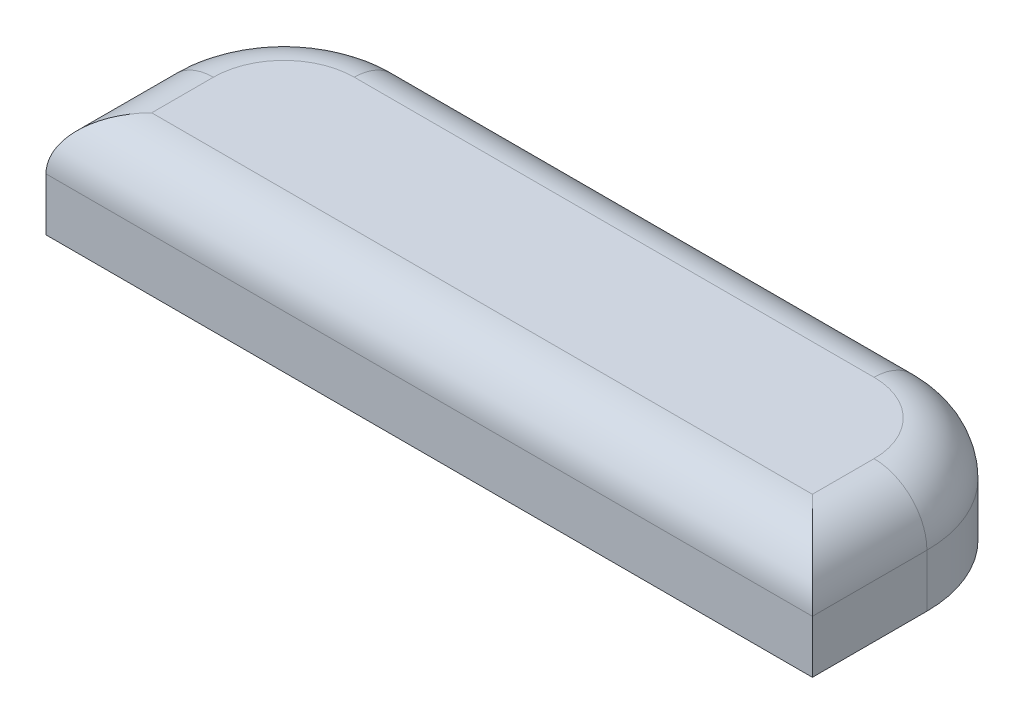
ISO-10303-21;
HEADER;
FILE_DESCRIPTION(('STEP AP214'),'2;1');
FILE_NAME('part.step','',(''),(''),'','','');
FILE_SCHEMA(('AUTOMOTIVE_DESIGN { 1 0 10303 214 1 1 1 1 }'));
ENDSEC;
DATA;
#1=APPLICATION_CONTEXT('core data for automotive mechanical design processes');
#2=APPLICATION_PROTOCOL_DEFINITION('international standard','automotive_design',2000,#1);
#3=PRODUCT_CONTEXT('',#1,'mechanical');
#4=PRODUCT('Part','Part','',(#3));
#5=PRODUCT_RELATED_PRODUCT_CATEGORY('part','',(#4));
#6=PRODUCT_DEFINITION_FORMATION('','',#4);
#7=PRODUCT_DEFINITION_CONTEXT('part definition',#1,'design');
#8=PRODUCT_DEFINITION('design','',#6,#7);
#9=PRODUCT_DEFINITION_SHAPE('','',#8);
#10=(LENGTH_UNIT() NAMED_UNIT(*) SI_UNIT(.MILLI.,.METRE.));
#11=(NAMED_UNIT(*) PLANE_ANGLE_UNIT() SI_UNIT($,.RADIAN.));
#12=(NAMED_UNIT(*) SI_UNIT($,.STERADIAN.) SOLID_ANGLE_UNIT());
#13=UNCERTAINTY_MEASURE_WITH_UNIT(LENGTH_MEASURE(1.E-05),#10,'distance_accuracy_value','');
#14=(GEOMETRIC_REPRESENTATION_CONTEXT(3) GLOBAL_UNCERTAINTY_ASSIGNED_CONTEXT((#13)) GLOBAL_UNIT_ASSIGNED_CONTEXT((#10,
#11,#12)) REPRESENTATION_CONTEXT('',''));
#15=CARTESIAN_POINT('',(0.,0.,0.));
#16=DIRECTION('',(0.,0.,1.));
#17=DIRECTION('',(1.,0.,0.));
#18=AXIS2_PLACEMENT_3D('',#15,#16,#17);
#19=CARTESIAN_POINT('',(382.577970856823,-283.78151591528,27.));
#20=DIRECTION('',(0.,0.,-1.));
#21=DIRECTION('',(-1.,0.,0.));
#22=AXIS2_PLACEMENT_3D('',#19,#20,#21);
#23=PLANE('',#22);
#24=DIRECTION('',(0.,-1.,0.));
#25=VECTOR('',#24,1.);
#26=CARTESIAN_POINT('',(469.577970856823,-283.78151591528,27.));
#27=LINE('',#26,#25);
#28=CARTESIAN_POINT('',(469.577970856823,-289.78151591528,27.));
#29=VERTEX_POINT('',#28);
#30=CARTESIAN_POINT('',(469.577970856823,-295.78151591528,27.));
#31=VERTEX_POINT('',#30);
#32=EDGE_CURVE('E107',#29,#31,#27,.T.);
#33=ORIENTED_EDGE('',*,*,#32,.F.);
#34=DIRECTION('',(1.,0.,0.));
#35=VECTOR('',#34,1.);
#36=CARTESIAN_POINT('',(382.577970856823,-289.78151591528,27.));
#37=LINE('',#36,#35);
#38=CARTESIAN_POINT('',(382.577970856823,-289.78151591528,27.));
#39=VERTEX_POINT('',#38);
#40=EDGE_CURVE('E11',#29,#39,#37,.F.);
#41=ORIENTED_EDGE('',*,*,#40,.T.);
#42=DIRECTION('',(0.,-1.,0.));
#43=VECTOR('',#42,1.);
#44=CARTESIAN_POINT('',(382.577970856823,-283.78151591528,27.));
#45=LINE('',#44,#43);
#46=CARTESIAN_POINT('',(382.577970856823,-295.78151591528,27.));
#47=VERTEX_POINT('',#46);
#48=EDGE_CURVE('E128',#39,#47,#45,.T.);
#49=ORIENTED_EDGE('',*,*,#48,.T.);
#50=DIRECTION('',(1.,0.,0.));
#51=VECTOR('',#50,1.);
#52=CARTESIAN_POINT('',(382.577970856823,-295.78151591528,27.));
#53=LINE('',#52,#51);
#54=EDGE_CURVE('E122',#47,#31,#53,.T.);
#55=ORIENTED_EDGE('',*,*,#54,.T.);
#56=EDGE_LOOP('',(#33,#41,#49,#55));
#57=FACE_BOUND('',#56,.T.);
#58=ADVANCED_FACE('F37',(#57),#23,.F.);
#59=CARTESIAN_POINT('',(469.577970856823,-283.78151591528,27.));
#60=DIRECTION('',(-1.,0.,0.));
#61=DIRECTION('',(0.,0.,1.));
#62=AXIS2_PLACEMENT_3D('',#59,#60,#61);
#63=PLANE('',#62);
#64=DIRECTION('',(0.,-1.,0.));
#65=VECTOR('',#64,1.);
#66=CARTESIAN_POINT('',(469.577970856823,-283.78151591528,14.));
#67=LINE('',#66,#65);
#68=CARTESIAN_POINT('',(469.577970856823,-289.78151591528,14.));
#69=VERTEX_POINT('',#68);
#70=CARTESIAN_POINT('',(469.577970856823,-295.78151591528,14.));
#71=VERTEX_POINT('',#70);
#72=EDGE_CURVE('E116',#69,#71,#67,.T.);
#73=ORIENTED_EDGE('',*,*,#72,.F.);
#74=DIRECTION('',(0.,0.,-1.));
#75=VECTOR('',#74,1.);
#76=CARTESIAN_POINT('',(469.577970856823,-289.78151591528,27.));
#77=LINE('',#76,#75);
#78=EDGE_CURVE('E46',#69,#29,#77,.F.);
#79=ORIENTED_EDGE('',*,*,#78,.T.);
#80=ORIENTED_EDGE('',*,*,#32,.T.);
#81=DIRECTION('',(0.,0.,-1.));
#82=VECTOR('',#81,1.);
#83=CARTESIAN_POINT('',(469.577970856823,-295.78151591528,27.));
#84=LINE('',#83,#82);
#85=EDGE_CURVE('E110',#31,#71,#84,.T.);
#86=ORIENTED_EDGE('',*,*,#85,.T.);
#87=EDGE_LOOP('',(#73,#79,#80,#86));
#88=FACE_BOUND('',#87,.T.);
#89=ADVANCED_FACE('F109',(#88),#63,.F.);
#90=CARTESIAN_POINT('',(455.577970856823,-283.78151591528,14.));
#91=DIRECTION('',(0.,-1.,0.));
#92=DIRECTION('',(0.,0.,-1.));
#93=AXIS2_PLACEMENT_3D('',#90,#91,#92);
#94=CYLINDRICAL_SURFACE('',#93,14.);
#95=DIRECTION('',(0.,-1.,0.));
#96=VECTOR('',#95,1.);
#97=CARTESIAN_POINT('',(455.577970856823,-283.78151591528,0.));
#98=LINE('',#97,#96);
#99=CARTESIAN_POINT('',(455.577970856823,-289.78151591528,0.));
#100=VERTEX_POINT('',#99);
#101=CARTESIAN_POINT('',(455.577970856823,-295.78151591528,0.));
#102=VERTEX_POINT('',#101);
#103=EDGE_CURVE('E148',#100,#102,#98,.T.);
#104=ORIENTED_EDGE('',*,*,#103,.F.);
#105=CARTESIAN_POINT('',(455.577970856823,-289.78151591528,14.));
#106=DIRECTION('',(0.,1.,0.));
#107=DIRECTION('',(0.,0.,1.));
#108=AXIS2_PLACEMENT_3D('',#105,#106,#107);
#109=CIRCLE('',#108,14.);
#110=EDGE_CURVE('E61',#100,#69,#109,.F.);
#111=ORIENTED_EDGE('',*,*,#110,.T.);
#112=ORIENTED_EDGE('',*,*,#72,.T.);
#113=CARTESIAN_POINT('',(455.577970856823,-295.78151591528,14.));
#114=DIRECTION('',(0.,1.,0.));
#115=DIRECTION('',(0.,0.,1.));
#116=AXIS2_PLACEMENT_3D('',#113,#114,#115);
#117=CIRCLE('',#116,14.);
#118=EDGE_CURVE('E125',#71,#102,#117,.T.);
#119=ORIENTED_EDGE('',*,*,#118,.T.);
#120=EDGE_LOOP('',(#104,#111,#112,#119));
#121=FACE_BOUND('',#120,.T.);
#122=ADVANCED_FACE('F230',(#121),#94,.T.);
#123=CARTESIAN_POINT('',(455.577970856823,-283.78151591528,0.));
#124=DIRECTION('',(0.,0.,1.));
#125=DIRECTION('',(1.,0.,0.));
#126=AXIS2_PLACEMENT_3D('',#123,#124,#125);
#127=PLANE('',#126);
#128=DIRECTION('',(0.,-1.,0.));
#129=VECTOR('',#128,1.);
#130=CARTESIAN_POINT('',(396.577970856823,-283.78151591528,0.));
#131=LINE('',#130,#129);
#132=CARTESIAN_POINT('',(396.577970856823,-289.78151591528,0.));
#133=VERTEX_POINT('',#132);
#134=CARTESIAN_POINT('',(396.577970856823,-295.78151591528,0.));
#135=VERTEX_POINT('',#134);
#136=EDGE_CURVE('E146',#133,#135,#131,.T.);
#137=ORIENTED_EDGE('',*,*,#136,.F.);
#138=DIRECTION('',(-1.,0.,0.));
#139=VECTOR('',#138,1.);
#140=CARTESIAN_POINT('',(455.577970856823,-289.78151591528,0.));
#141=LINE('',#140,#139);
#142=EDGE_CURVE('E168',#133,#100,#141,.F.);
#143=ORIENTED_EDGE('',*,*,#142,.T.);
#144=ORIENTED_EDGE('',*,*,#103,.T.);
#145=DIRECTION('',(-1.,0.,0.));
#146=VECTOR('',#145,1.);
#147=CARTESIAN_POINT('',(455.577970856823,-295.78151591528,0.));
#148=LINE('',#147,#146);
#149=EDGE_CURVE('E135',#102,#135,#148,.T.);
#150=ORIENTED_EDGE('',*,*,#149,.T.);
#151=EDGE_LOOP('',(#137,#143,#144,#150));
#152=FACE_BOUND('',#151,.T.);
#153=ADVANCED_FACE('F215',(#152),#127,.F.);
#154=CARTESIAN_POINT('',(396.577970856823,-283.78151591528,14.));
#155=DIRECTION('',(0.,-1.,0.));
#156=DIRECTION('',(0.,0.,-1.));
#157=AXIS2_PLACEMENT_3D('',#154,#155,#156);
#158=CYLINDRICAL_SURFACE('',#157,14.);
#159=DIRECTION('',(0.,-1.,0.));
#160=VECTOR('',#159,1.);
#161=CARTESIAN_POINT('',(382.577970856823,-283.78151591528,14.));
#162=LINE('',#161,#160);
#163=CARTESIAN_POINT('',(382.577970856823,-289.78151591528,14.));
#164=VERTEX_POINT('',#163);
#165=CARTESIAN_POINT('',(382.577970856823,-295.78151591528,14.));
#166=VERTEX_POINT('',#165);
#167=EDGE_CURVE('E144',#164,#166,#162,.T.);
#168=ORIENTED_EDGE('',*,*,#167,.F.);
#169=CARTESIAN_POINT('',(396.577970856823,-289.78151591528,14.));
#170=DIRECTION('',(0.,1.,0.));
#171=DIRECTION('',(0.,0.,1.));
#172=AXIS2_PLACEMENT_3D('',#169,#170,#171);
#173=CIRCLE('',#172,14.);
#174=EDGE_CURVE('E166',#164,#133,#173,.F.);
#175=ORIENTED_EDGE('',*,*,#174,.T.);
#176=ORIENTED_EDGE('',*,*,#136,.T.);
#177=CARTESIAN_POINT('',(396.577970856823,-295.78151591528,14.));
#178=DIRECTION('',(0.,1.,0.));
#179=DIRECTION('',(0.,0.,1.));
#180=AXIS2_PLACEMENT_3D('',#177,#178,#179);
#181=CIRCLE('',#180,14.);
#182=EDGE_CURVE('E138',#135,#166,#181,.T.);
#183=ORIENTED_EDGE('',*,*,#182,.T.);
#184=EDGE_LOOP('',(#168,#175,#176,#183));
#185=FACE_BOUND('',#184,.T.);
#186=ADVANCED_FACE('F212',(#185),#158,.T.);
#187=CARTESIAN_POINT('',(382.577970856823,-283.78151591528,14.));
#188=DIRECTION('',(1.,0.,0.));
#189=DIRECTION('',(0.,0.,-1.));
#190=AXIS2_PLACEMENT_3D('',#187,#188,#189);
#191=PLANE('',#190);
#192=ORIENTED_EDGE('',*,*,#48,.F.);
#193=DIRECTION('',(0.,0.,1.));
#194=VECTOR('',#193,1.);
#195=CARTESIAN_POINT('',(382.577970856823,-289.78151591528,14.));
#196=LINE('',#195,#194);
#197=EDGE_CURVE('E163',#39,#164,#196,.F.);
#198=ORIENTED_EDGE('',*,*,#197,.T.);
#199=ORIENTED_EDGE('',*,*,#167,.T.);
#200=DIRECTION('',(0.,0.,1.));
#201=VECTOR('',#200,1.);
#202=CARTESIAN_POINT('',(382.577970856823,-295.78151591528,14.));
#203=LINE('',#202,#201);
#204=EDGE_CURVE('E141',#166,#47,#203,.T.);
#205=ORIENTED_EDGE('',*,*,#204,.T.);
#206=EDGE_LOOP('',(#192,#198,#199,#205));
#207=FACE_BOUND('',#206,.T.);
#208=ADVANCED_FACE('F201',(#207),#191,.F.);
#209=CARTESIAN_POINT('',(455.577970856823,-283.78151591528,14.));
#210=DIRECTION('',(0.,1.,0.));
#211=DIRECTION('',(0.,0.,1.));
#212=AXIS2_PLACEMENT_3D('',#209,#210,#211);
#213=PLANE('',#212);
#214=CARTESIAN_POINT('',(396.577970856823,-283.78151591528,14.));
#215=DIRECTION('',(0.,1.,0.));
#216=DIRECTION('',(0.,0.,1.));
#217=AXIS2_PLACEMENT_3D('',#214,#215,#216);
#218=CIRCLE('',#217,8.00000000000001);
#219=CARTESIAN_POINT('',(396.577970856823,-283.78151591528,6.));
#220=VERTEX_POINT('',#219);
#221=CARTESIAN_POINT('',(388.577970856823,-283.78151591528,14.));
#222=VERTEX_POINT('',#221);
#223=EDGE_CURVE('E158',#220,#222,#218,.T.);
#224=ORIENTED_EDGE('',*,*,#223,.T.);
#225=DIRECTION('',(0.,0.,1.));
#226=VECTOR('',#225,1.);
#227=CARTESIAN_POINT('',(388.577970856823,-283.78151591528,27.));
#228=LINE('',#227,#226);
#229=CARTESIAN_POINT('',(388.577970856823,-283.78151591528,21.));
#230=VERTEX_POINT('',#229);
#231=EDGE_CURVE('E160',#222,#230,#228,.T.);
#232=ORIENTED_EDGE('',*,*,#231,.T.);
#233=DIRECTION('',(1.,0.,0.));
#234=VECTOR('',#233,1.);
#235=CARTESIAN_POINT('',(469.577970856823,-283.78151591528,21.));
#236=LINE('',#235,#234);
#237=CARTESIAN_POINT('',(463.577970856823,-283.78151591528,21.));
#238=VERTEX_POINT('',#237);
#239=EDGE_CURVE('E115',#230,#238,#236,.T.);
#240=ORIENTED_EDGE('',*,*,#239,.T.);
#241=DIRECTION('',(0.,0.,-1.));
#242=VECTOR('',#241,1.);
#243=CARTESIAN_POINT('',(463.577970856823,-283.78151591528,14.));
#244=LINE('',#243,#242);
#245=CARTESIAN_POINT('',(463.577970856823,-283.78151591528,14.));
#246=VERTEX_POINT('',#245);
#247=EDGE_CURVE('E152',#238,#246,#244,.T.);
#248=ORIENTED_EDGE('',*,*,#247,.T.);
#249=CARTESIAN_POINT('',(455.577970856823,-283.78151591528,14.));
#250=DIRECTION('',(0.,1.,0.));
#251=DIRECTION('',(0.,0.,1.));
#252=AXIS2_PLACEMENT_3D('',#249,#250,#251);
#253=CIRCLE('',#252,8.00000000000001);
#254=CARTESIAN_POINT('',(455.577970856823,-283.78151591528,5.99999999999999));
#255=VERTEX_POINT('',#254);
#256=EDGE_CURVE('E154',#246,#255,#253,.T.);
#257=ORIENTED_EDGE('',*,*,#256,.T.);
#258=DIRECTION('',(-1.,0.,0.));
#259=VECTOR('',#258,1.);
#260=CARTESIAN_POINT('',(396.577970856823,-283.78151591528,6.));
#261=LINE('',#260,#259);
#262=EDGE_CURVE('E156',#255,#220,#261,.T.);
#263=ORIENTED_EDGE('',*,*,#262,.T.);
#264=EDGE_LOOP('',(#224,#232,#240,#248,#257,#263));
#265=FACE_BOUND('',#264,.T.);
#266=ADVANCED_FACE('F191',(#265),#213,.T.);
#267=CARTESIAN_POINT('',(455.577970856823,-295.78151591528,14.));
#268=DIRECTION('',(0.,1.,0.));
#269=DIRECTION('',(0.,0.,1.));
#270=AXIS2_PLACEMENT_3D('',#267,#268,#269);
#271=PLANE('',#270);
#272=ORIENTED_EDGE('',*,*,#54,.F.);
#273=ORIENTED_EDGE('',*,*,#204,.F.);
#274=ORIENTED_EDGE('',*,*,#182,.F.);
#275=ORIENTED_EDGE('',*,*,#149,.F.);
#276=ORIENTED_EDGE('',*,*,#118,.F.);
#277=ORIENTED_EDGE('',*,*,#85,.F.);
#278=EDGE_LOOP('',(#272,#273,#274,#275,#276,#277));
#279=FACE_BOUND('',#278,.T.);
#280=ADVANCED_FACE('F120',(#279),#271,.F.);
#281=CARTESIAN_POINT('',(455.577970856823,-289.78151591528,14.));
#282=DIRECTION('',(0.,1.,0.));
#283=DIRECTION('',(0.,0.,1.));
#284=AXIS2_PLACEMENT_3D('',#281,#282,#283);
#285=TOROIDAL_SURFACE('',#284,8.00000000000001,6.);
#286=CARTESIAN_POINT('',(463.577970856823,-289.78151591528,14.));
#287=DIRECTION('',(0.,0.,1.));
#288=DIRECTION('',(1.,0.,0.));
#289=AXIS2_PLACEMENT_3D('',#286,#287,#288);
#290=CIRCLE('',#289,6.);
#291=EDGE_CURVE('E132',#69,#246,#290,.T.);
#292=ORIENTED_EDGE('',*,*,#291,.F.);
#293=ORIENTED_EDGE('',*,*,#110,.F.);
#294=CARTESIAN_POINT('',(455.577970856823,-289.78151591528,5.99999999999999));
#295=DIRECTION('',(-1.,0.,0.));
#296=DIRECTION('',(0.,0.,1.));
#297=AXIS2_PLACEMENT_3D('',#294,#295,#296);
#298=CIRCLE('',#297,6.);
#299=EDGE_CURVE('E41',#255,#100,#298,.T.);
#300=ORIENTED_EDGE('',*,*,#299,.F.);
#301=ORIENTED_EDGE('',*,*,#256,.F.);
#302=EDGE_LOOP('',(#292,#293,#300,#301));
#303=FACE_BOUND('',#302,.T.);
#304=ADVANCED_FACE('F39',(#303),#285,.T.);
#305=CARTESIAN_POINT('',(455.577970856823,-289.78151591528,5.99999999999999));
#306=DIRECTION('',(1.,0.,0.));
#307=DIRECTION('',(0.,0.,-1.));
#308=AXIS2_PLACEMENT_3D('',#305,#306,#307);
#309=CYLINDRICAL_SURFACE('',#308,6.);
#310=ORIENTED_EDGE('',*,*,#299,.T.);
#311=ORIENTED_EDGE('',*,*,#142,.F.);
#312=CARTESIAN_POINT('',(396.577970856823,-289.78151591528,6.));
#313=DIRECTION('',(-1.,0.,0.));
#314=DIRECTION('',(0.,0.,1.));
#315=AXIS2_PLACEMENT_3D('',#312,#313,#314);
#316=CIRCLE('',#315,6.);
#317=EDGE_CURVE('E179',#220,#133,#316,.T.);
#318=ORIENTED_EDGE('',*,*,#317,.F.);
#319=ORIENTED_EDGE('',*,*,#262,.F.);
#320=EDGE_LOOP('',(#310,#311,#318,#319));
#321=FACE_BOUND('',#320,.T.);
#322=ADVANCED_FACE('F218',(#321),#309,.T.);
#323=CARTESIAN_POINT('',(463.577970856823,-289.78151591528,14.));
#324=DIRECTION('',(0.,0.,1.));
#325=DIRECTION('',(1.,0.,0.));
#326=AXIS2_PLACEMENT_3D('',#323,#324,#325);
#327=CYLINDRICAL_SURFACE('',#326,6.);
#328=ORIENTED_EDGE('',*,*,#291,.T.);
#329=ORIENTED_EDGE('',*,*,#247,.F.);
#330=CARTESIAN_POINT('',(463.577970856823,-289.78151591528,21.));
#331=DIRECTION('',(-0.707106781186547,0.,0.707106781186547));
#332=DIRECTION('',(-0.707106781186547,0.,-0.707106781186547));
#333=AXIS2_PLACEMENT_3D('',#330,#331,#332);
#334=ELLIPSE('',#333,8.48528137423857,6.);
#335=EDGE_CURVE('E176',#29,#238,#334,.T.);
#336=ORIENTED_EDGE('',*,*,#335,.F.);
#337=ORIENTED_EDGE('',*,*,#78,.F.);
#338=EDGE_LOOP('',(#328,#329,#336,#337));
#339=FACE_BOUND('',#338,.T.);
#340=ADVANCED_FACE('F185',(#339),#327,.T.);
#341=CARTESIAN_POINT('',(396.577970856823,-289.78151591528,14.));
#342=DIRECTION('',(0.,1.,0.));
#343=DIRECTION('',(0.,0.,1.));
#344=AXIS2_PLACEMENT_3D('',#341,#342,#343);
#345=TOROIDAL_SURFACE('',#344,8.00000000000001,6.);
#346=ORIENTED_EDGE('',*,*,#317,.T.);
#347=ORIENTED_EDGE('',*,*,#174,.F.);
#348=CARTESIAN_POINT('',(388.577970856823,-289.78151591528,14.));
#349=DIRECTION('',(0.,0.,1.));
#350=DIRECTION('',(1.,0.,0.));
#351=AXIS2_PLACEMENT_3D('',#348,#349,#350);
#352=CIRCLE('',#351,6.);
#353=EDGE_CURVE('E174',#222,#164,#352,.T.);
#354=ORIENTED_EDGE('',*,*,#353,.F.);
#355=ORIENTED_EDGE('',*,*,#223,.F.);
#356=EDGE_LOOP('',(#346,#347,#354,#355));
#357=FACE_BOUND('',#356,.T.);
#358=ADVANCED_FACE('F209',(#357),#345,.T.);
#359=CARTESIAN_POINT('',(455.577970856823,-289.78151591528,21.));
#360=DIRECTION('',(-1.,0.,0.));
#361=DIRECTION('',(0.,0.,1.));
#362=AXIS2_PLACEMENT_3D('',#359,#360,#361);
#363=CYLINDRICAL_SURFACE('',#362,6.);
#364=ORIENTED_EDGE('',*,*,#335,.T.);
#365=ORIENTED_EDGE('',*,*,#239,.F.);
#366=CARTESIAN_POINT('',(388.577970856823,-289.78151591528,21.));
#367=DIRECTION('',(-0.707106781186547,0.,-0.707106781186547));
#368=DIRECTION('',(-0.707106781186547,0.,0.707106781186547));
#369=AXIS2_PLACEMENT_3D('',#366,#367,#368);
#370=ELLIPSE('',#369,8.48528137423857,6.);
#371=EDGE_CURVE('E172',#39,#230,#370,.T.);
#372=ORIENTED_EDGE('',*,*,#371,.F.);
#373=ORIENTED_EDGE('',*,*,#40,.F.);
#374=EDGE_LOOP('',(#364,#365,#372,#373));
#375=FACE_BOUND('',#374,.T.);
#376=ADVANCED_FACE('F197',(#375),#363,.T.);
#377=CARTESIAN_POINT('',(388.577970856823,-289.78151591528,14.));
#378=DIRECTION('',(0.,0.,-1.));
#379=DIRECTION('',(-1.,0.,0.));
#380=AXIS2_PLACEMENT_3D('',#377,#378,#379);
#381=CYLINDRICAL_SURFACE('',#380,6.);
#382=ORIENTED_EDGE('',*,*,#353,.T.);
#383=ORIENTED_EDGE('',*,*,#197,.F.);
#384=ORIENTED_EDGE('',*,*,#371,.T.);
#385=ORIENTED_EDGE('',*,*,#231,.F.);
#386=EDGE_LOOP('',(#382,#383,#384,#385));
#387=FACE_BOUND('',#386,.T.);
#388=ADVANCED_FACE('F204',(#387),#381,.T.);
#389=CLOSED_SHELL('',(#58,#89,#122,#153,#186,#208,#266,#280,#304,#322,#340,#358,#376,#388));
#390=MANIFOLD_SOLID_BREP('B2',#389);
#391=ADVANCED_BREP_SHAPE_REPRESENTATION('',(#18,#390),#14);
#392=SHAPE_DEFINITION_REPRESENTATION(#9,#391);
ENDSEC;
END-ISO-10303-21;
